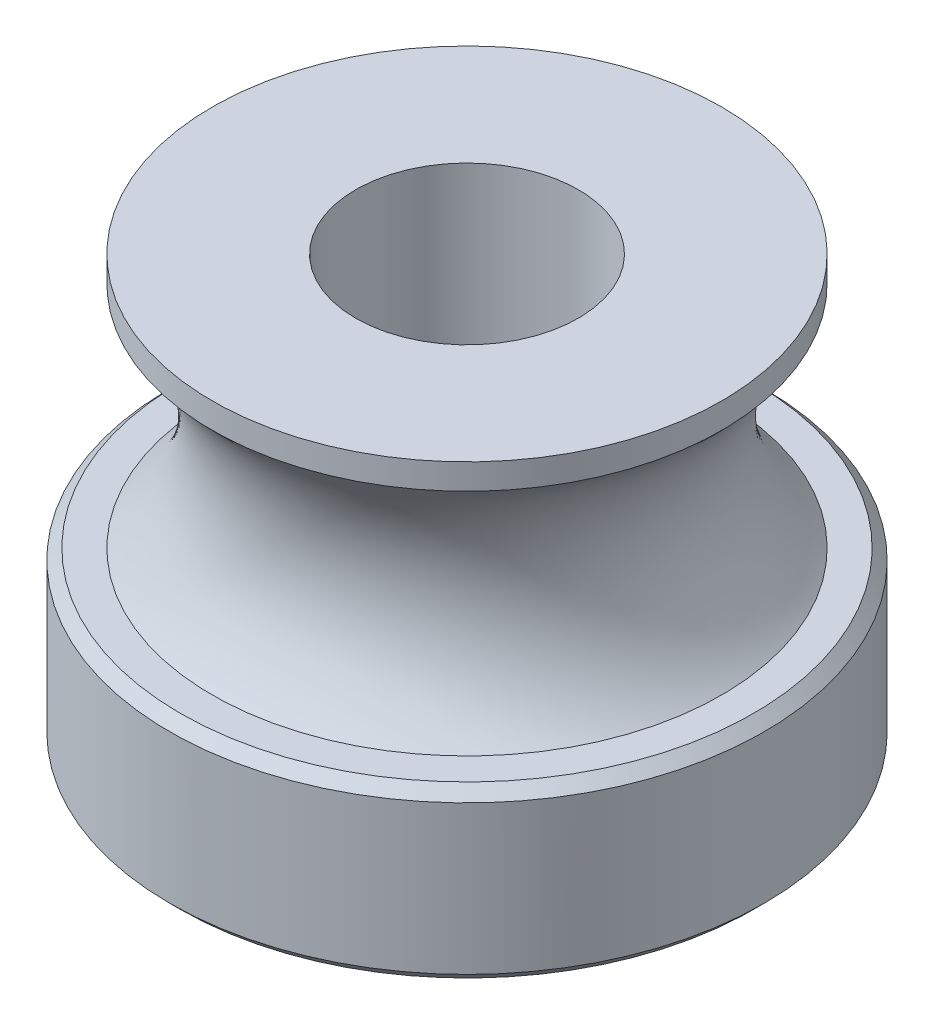
ISO-10303-21;
HEADER;
FILE_DESCRIPTION(('STEP AP214'),'2;1');
FILE_NAME('part.step','',(''),(''),'','','');
FILE_SCHEMA(('AUTOMOTIVE_DESIGN { 1 0 10303 214 1 1 1 1 }'));
ENDSEC;
DATA;
#1=APPLICATION_CONTEXT('core data for automotive mechanical design processes');
#2=APPLICATION_PROTOCOL_DEFINITION('international standard','automotive_design',2000,#1);
#3=PRODUCT_CONTEXT('',#1,'mechanical');
#4=PRODUCT('Part','Part','',(#3));
#5=PRODUCT_RELATED_PRODUCT_CATEGORY('part','',(#4));
#6=PRODUCT_DEFINITION_FORMATION('','',#4);
#7=PRODUCT_DEFINITION_CONTEXT('part definition',#1,'design');
#8=PRODUCT_DEFINITION('design','',#6,#7);
#9=PRODUCT_DEFINITION_SHAPE('','',#8);
#10=(LENGTH_UNIT() NAMED_UNIT(*) SI_UNIT(.MILLI.,.METRE.));
#11=(NAMED_UNIT(*) PLANE_ANGLE_UNIT() SI_UNIT($,.RADIAN.));
#12=(NAMED_UNIT(*) SI_UNIT($,.STERADIAN.) SOLID_ANGLE_UNIT());
#13=UNCERTAINTY_MEASURE_WITH_UNIT(LENGTH_MEASURE(1.E-05),#10,'distance_accuracy_value','');
#14=(GEOMETRIC_REPRESENTATION_CONTEXT(3) GLOBAL_UNCERTAINTY_ASSIGNED_CONTEXT((#13)) GLOBAL_UNIT_ASSIGNED_CONTEXT((#10,
#11,#12)) REPRESENTATION_CONTEXT('',''));
#15=CARTESIAN_POINT('',(0.,0.,0.));
#16=DIRECTION('',(0.,0.,1.));
#17=DIRECTION('',(1.,0.,0.));
#18=AXIS2_PLACEMENT_3D('',#15,#16,#17);
#19=CARTESIAN_POINT('',(0.,7.9375,0.));
#20=DIRECTION('',(0.,-1.,0.));
#21=DIRECTION('',(0.,0.,-1.));
#22=AXIS2_PLACEMENT_3D('',#19,#20,#21);
#23=PLANE('',#22);
#24=CARTESIAN_POINT('',(0.,7.9375,0.));
#25=DIRECTION('',(0.,-1.,0.));
#26=DIRECTION('',(0.,0.,-1.));
#27=AXIS2_PLACEMENT_3D('',#24,#25,#26);
#28=CIRCLE('',#27,4.7625);
#29=CARTESIAN_POINT('',(0.,7.9375,-4.7625));
#30=VERTEX_POINT('',#29);
#31=EDGE_CURVE('E55',#30,#30,#28,.T.);
#32=ORIENTED_EDGE('',*,*,#31,.F.);
#33=EDGE_LOOP('',(#32));
#34=FACE_BOUND('',#33,.T.);
#35=CARTESIAN_POINT('',(0.,7.9375,0.));
#36=DIRECTION('',(0.,1.,0.));
#37=DIRECTION('',(0.,0.,1.));
#38=AXIS2_PLACEMENT_3D('',#35,#36,#37);
#39=CIRCLE('',#38,2.0828);
#40=CARTESIAN_POINT('',(0.,7.9375,2.0828));
#41=VERTEX_POINT('',#40);
#42=EDGE_CURVE('E64',#41,#41,#39,.T.);
#43=ORIENTED_EDGE('',*,*,#42,.F.);
#44=EDGE_LOOP('',(#43));
#45=FACE_BOUND('',#44,.T.);
#46=ADVANCED_FACE('F35',(#34,#45),#23,.F.);
#47=CARTESIAN_POINT('',(-5.55625,0.,0.));
#48=DIRECTION('',(0.,1.,0.));
#49=DIRECTION('',(0.,0.,1.));
#50=AXIS2_PLACEMENT_3D('',#47,#48,#49);
#51=PLANE('',#50);
#52=CARTESIAN_POINT('',(0.,0.,0.));
#53=DIRECTION('',(0.,1.,0.));
#54=DIRECTION('',(0.,0.,1.));
#55=AXIS2_PLACEMENT_3D('',#52,#53,#54);
#56=CIRCLE('',#55,5.35781249999999);
#57=CARTESIAN_POINT('',(0.,0.,5.35781249999999));
#58=VERTEX_POINT('',#57);
#59=EDGE_CURVE('E10',#58,#58,#56,.F.);
#60=ORIENTED_EDGE('',*,*,#59,.T.);
#61=EDGE_LOOP('',(#60));
#62=FACE_BOUND('',#61,.T.);
#63=CARTESIAN_POINT('',(0.,0.,0.));
#64=DIRECTION('',(0.,1.,0.));
#65=DIRECTION('',(0.,0.,1.));
#66=AXIS2_PLACEMENT_3D('',#63,#64,#65);
#67=CIRCLE('',#66,2.0828);
#68=CARTESIAN_POINT('',(0.,0.,2.0828));
#69=VERTEX_POINT('',#68);
#70=EDGE_CURVE('E65',#69,#69,#67,.T.);
#71=ORIENTED_EDGE('',*,*,#70,.T.);
#72=EDGE_LOOP('',(#71));
#73=FACE_BOUND('',#72,.T.);
#74=ADVANCED_FACE('F75',(#62,#73),#51,.F.);
#75=CARTESIAN_POINT('',(0.,0.,0.));
#76=DIRECTION('',(0.,-1.,0.));
#77=DIRECTION('',(0.,0.,-1.));
#78=AXIS2_PLACEMENT_3D('',#75,#76,#77);
#79=CYLINDRICAL_SURFACE('',#78,4.7625);
#80=CARTESIAN_POINT('',(0.,7.46125,0.));
#81=DIRECTION('',(0.,-1.,0.));
#82=DIRECTION('',(0.,0.,-1.));
#83=AXIS2_PLACEMENT_3D('',#80,#81,#82);
#84=CIRCLE('',#83,4.7625);
#85=CARTESIAN_POINT('',(0.,7.46125,-4.7625));
#86=VERTEX_POINT('',#85);
#87=EDGE_CURVE('E58',#86,#86,#84,.T.);
#88=ORIENTED_EDGE('',*,*,#87,.F.);
#89=EDGE_LOOP('',(#88));
#90=FACE_BOUND('',#89,.T.);
#91=ORIENTED_EDGE('',*,*,#31,.T.);
#92=EDGE_LOOP('',(#91));
#93=FACE_BOUND('',#92,.T.);
#94=ADVANCED_FACE('F81',(#90,#93),#79,.T.);
#95=CARTESIAN_POINT('',(0.,5.318125,0.));
#96=DIRECTION('',(0.,-1.,0.));
#97=DIRECTION('',(0.,0.,-1.));
#98=AXIS2_PLACEMENT_3D('',#95,#96,#97);
#99=TOROIDAL_SURFACE('',#98,6.697265625,2.887265625);
#100=CARTESIAN_POINT('',(0.,3.175,0.));
#101=DIRECTION('',(0.,-1.,0.));
#102=DIRECTION('',(0.,0.,-1.));
#103=AXIS2_PLACEMENT_3D('',#100,#101,#102);
#104=CIRCLE('',#103,4.7625);
#105=CARTESIAN_POINT('',(0.,3.175,-4.7625));
#106=VERTEX_POINT('',#105);
#107=EDGE_CURVE('E61',#106,#106,#104,.T.);
#108=ORIENTED_EDGE('',*,*,#107,.F.);
#109=EDGE_LOOP('',(#108));
#110=FACE_BOUND('',#109,.T.);
#111=ORIENTED_EDGE('',*,*,#87,.T.);
#112=EDGE_LOOP('',(#111));
#113=FACE_BOUND('',#112,.T.);
#114=ADVANCED_FACE('F108',(#110,#113),#99,.F.);
#115=CARTESIAN_POINT('',(-5.55625,3.175,0.));
#116=DIRECTION('',(0.,-1.,0.));
#117=DIRECTION('',(0.,0.,-1.));
#118=AXIS2_PLACEMENT_3D('',#115,#116,#117);
#119=PLANE('',#118);
#120=CARTESIAN_POINT('',(0.,3.175,0.));
#121=DIRECTION('',(0.,-1.,0.));
#122=DIRECTION('',(0.,0.,-1.));
#123=AXIS2_PLACEMENT_3D('',#120,#121,#122);
#124=CIRCLE('',#123,5.3578125);
#125=CARTESIAN_POINT('',(0.,3.175,-5.3578125));
#126=VERTEX_POINT('',#125);
#127=EDGE_CURVE('E42',#126,#126,#124,.F.);
#128=ORIENTED_EDGE('',*,*,#127,.T.);
#129=EDGE_LOOP('',(#128));
#130=FACE_BOUND('',#129,.T.);
#131=ORIENTED_EDGE('',*,*,#107,.T.);
#132=EDGE_LOOP('',(#131));
#133=FACE_BOUND('',#132,.T.);
#134=ADVANCED_FACE('F101',(#130,#133),#119,.F.);
#135=CARTESIAN_POINT('',(0.,0.,0.));
#136=DIRECTION('',(0.,-1.,0.));
#137=DIRECTION('',(0.,0.,-1.));
#138=AXIS2_PLACEMENT_3D('',#135,#136,#137);
#139=CYLINDRICAL_SURFACE('',#138,5.55625);
#140=CARTESIAN_POINT('',(0.,2.9765625,0.));
#141=DIRECTION('',(0.,-1.,0.));
#142=DIRECTION('',(0.,0.,-1.));
#143=AXIS2_PLACEMENT_3D('',#140,#141,#142);
#144=CIRCLE('',#143,5.55625);
#145=CARTESIAN_POINT('',(0.,2.9765625,-5.55625));
#146=VERTEX_POINT('',#145);
#147=EDGE_CURVE('E46',#146,#146,#144,.T.);
#148=ORIENTED_EDGE('',*,*,#147,.T.);
#149=EDGE_LOOP('',(#148));
#150=FACE_BOUND('',#149,.T.);
#151=CARTESIAN_POINT('',(0.,0.198437500000002,0.));
#152=DIRECTION('',(0.,1.,0.));
#153=DIRECTION('',(0.,0.,1.));
#154=AXIS2_PLACEMENT_3D('',#151,#152,#153);
#155=CIRCLE('',#154,5.55625);
#156=CARTESIAN_POINT('',(0.,0.198437500000002,5.55625));
#157=VERTEX_POINT('',#156);
#158=EDGE_CURVE('E50',#157,#157,#155,.T.);
#159=ORIENTED_EDGE('',*,*,#158,.T.);
#160=EDGE_LOOP('',(#159));
#161=FACE_BOUND('',#160,.T.);
#162=ADVANCED_FACE('F94',(#150,#161),#139,.T.);
#163=CARTESIAN_POINT('',(0.,7.9375,0.));
#164=DIRECTION('',(0.,-1.,0.));
#165=DIRECTION('',(0.,0.,-1.));
#166=AXIS2_PLACEMENT_3D('',#163,#164,#165);
#167=CYLINDRICAL_SURFACE('',#166,2.0828);
#168=ORIENTED_EDGE('',*,*,#42,.T.);
#169=EDGE_LOOP('',(#168));
#170=FACE_BOUND('',#169,.T.);
#171=ORIENTED_EDGE('',*,*,#70,.F.);
#172=EDGE_LOOP('',(#171));
#173=FACE_BOUND('',#172,.T.);
#174=ADVANCED_FACE('F71',(#170,#173),#167,.F.);
#175=CARTESIAN_POINT('',(0.,2.9765625,0.));
#176=DIRECTION('',(0.,-1.,0.));
#177=DIRECTION('',(0.,0.,-1.));
#178=AXIS2_PLACEMENT_3D('',#175,#176,#177);
#179=CONICAL_SURFACE('',#178,5.55625,0.78539816339745);
#180=ORIENTED_EDGE('',*,*,#127,.F.);
#181=EDGE_LOOP('',(#180));
#182=FACE_BOUND('',#181,.T.);
#183=ORIENTED_EDGE('',*,*,#147,.F.);
#184=EDGE_LOOP('',(#183));
#185=FACE_BOUND('',#184,.T.);
#186=ADVANCED_FACE('F86',(#182,#185),#179,.T.);
#187=CARTESIAN_POINT('',(0.,0.,0.));
#188=DIRECTION('',(0.,1.,0.));
#189=DIRECTION('',(0.,0.,1.));
#190=AXIS2_PLACEMENT_3D('',#187,#188,#189);
#191=CONICAL_SURFACE('',#190,5.35781249999999,0.785398163397453);
#192=ORIENTED_EDGE('',*,*,#158,.F.);
#193=EDGE_LOOP('',(#192));
#194=FACE_BOUND('',#193,.T.);
#195=ORIENTED_EDGE('',*,*,#59,.F.);
#196=EDGE_LOOP('',(#195));
#197=FACE_BOUND('',#196,.T.);
#198=ADVANCED_FACE('F37',(#194,#197),#191,.T.);
#199=CLOSED_SHELL('',(#46,#74,#94,#114,#134,#162,#174,#186,#198));
#200=MANIFOLD_SOLID_BREP('B2',#199);
#201=ADVANCED_BREP_SHAPE_REPRESENTATION('',(#18,#200),#14);
#202=SHAPE_DEFINITION_REPRESENTATION(#9,#201);
ENDSEC;
END-ISO-10303-21;
